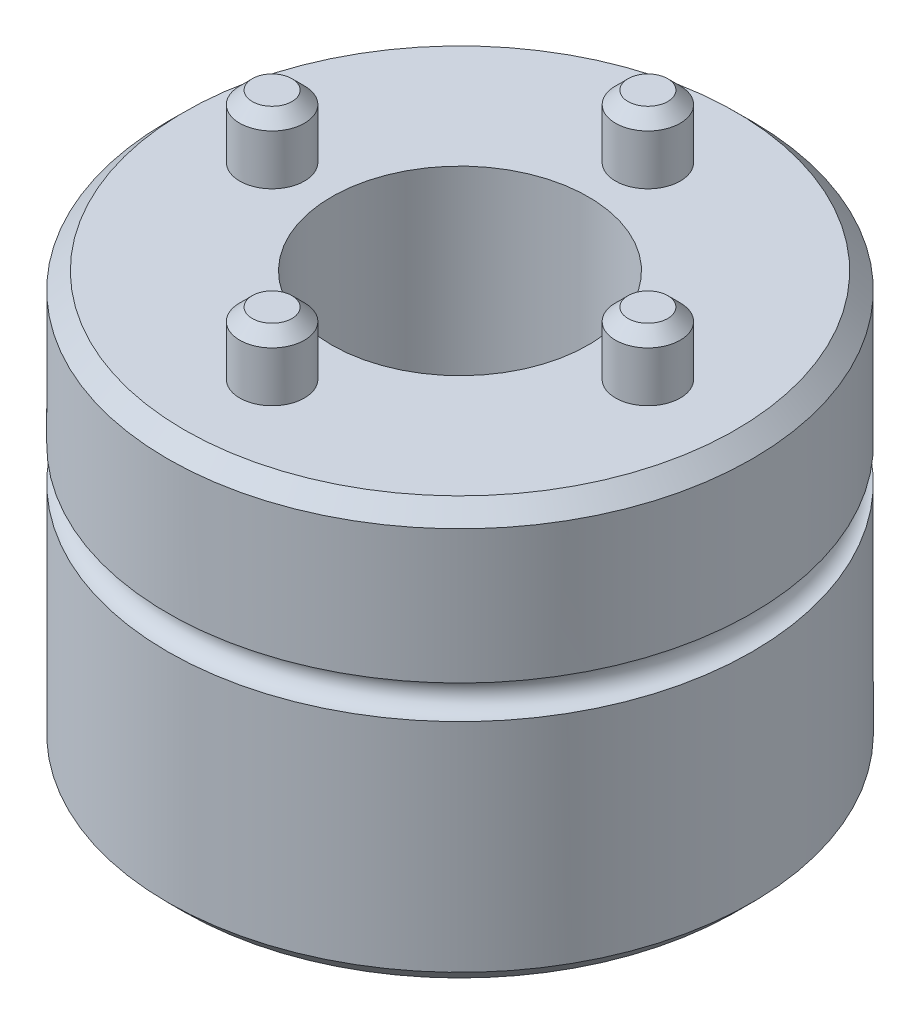
ISO-10303-21;
HEADER;
FILE_DESCRIPTION(('STEP AP214'),'2;1');
FILE_NAME('part.step','',(''),(''),'','','');
FILE_SCHEMA(('AUTOMOTIVE_DESIGN { 1 0 10303 214 1 1 1 1 }'));
ENDSEC;
DATA;
#1=APPLICATION_CONTEXT('core data for automotive mechanical design processes');
#2=APPLICATION_PROTOCOL_DEFINITION('international standard','automotive_design',2000,#1);
#3=PRODUCT_CONTEXT('',#1,'mechanical');
#4=PRODUCT('Part','Part','',(#3));
#5=PRODUCT_RELATED_PRODUCT_CATEGORY('part','',(#4));
#6=PRODUCT_DEFINITION_FORMATION('','',#4);
#7=PRODUCT_DEFINITION_CONTEXT('part definition',#1,'design');
#8=PRODUCT_DEFINITION('design','',#6,#7);
#9=PRODUCT_DEFINITION_SHAPE('','',#8);
#10=(LENGTH_UNIT() NAMED_UNIT(*) SI_UNIT(.MILLI.,.METRE.));
#11=(NAMED_UNIT(*) PLANE_ANGLE_UNIT() SI_UNIT($,.RADIAN.));
#12=(NAMED_UNIT(*) SI_UNIT($,.STERADIAN.) SOLID_ANGLE_UNIT());
#13=UNCERTAINTY_MEASURE_WITH_UNIT(LENGTH_MEASURE(1.E-05),#10,'distance_accuracy_value','');
#14=(GEOMETRIC_REPRESENTATION_CONTEXT(3) GLOBAL_UNCERTAINTY_ASSIGNED_CONTEXT((#13)) GLOBAL_UNIT_ASSIGNED_CONTEXT((#10,
#11,#12)) REPRESENTATION_CONTEXT('',''));
#15=CARTESIAN_POINT('',(0.,0.,0.));
#16=DIRECTION('',(0.,0.,1.));
#17=DIRECTION('',(1.,0.,0.));
#18=AXIS2_PLACEMENT_3D('',#15,#16,#17);
#19=CARTESIAN_POINT('',(0.,5.,0.));
#20=DIRECTION('',(0.,-1.,0.));
#21=DIRECTION('',(0.,0.,-1.));
#22=AXIS2_PLACEMENT_3D('',#19,#20,#21);
#23=CYLINDRICAL_SURFACE('',#22,7.);
#24=CARTESIAN_POINT('',(0.,-4.6,0.));
#25=DIRECTION('',(0.,1.,0.));
#26=DIRECTION('',(0.,0.,1.));
#27=AXIS2_PLACEMENT_3D('',#24,#25,#26);
#28=CIRCLE('',#27,7.);
#29=CARTESIAN_POINT('',(0.,-4.6,7.));
#30=VERTEX_POINT('',#29);
#31=EDGE_CURVE('E59',#30,#30,#28,.T.);
#32=ORIENTED_EDGE('',*,*,#31,.T.);
#33=EDGE_LOOP('',(#32));
#34=FACE_BOUND('',#33,.T.);
#35=CARTESIAN_POINT('',(0.,0.6,0.));
#36=DIRECTION('',(0.,1.,0.));
#37=DIRECTION('',(0.,0.,1.));
#38=AXIS2_PLACEMENT_3D('',#35,#36,#37);
#39=CIRCLE('',#38,7.);
#40=CARTESIAN_POINT('',(0.,0.6,7.));
#41=VERTEX_POINT('',#40);
#42=EDGE_CURVE('E65',#41,#41,#39,.F.);
#43=ORIENTED_EDGE('',*,*,#42,.T.);
#44=EDGE_LOOP('',(#43));
#45=FACE_BOUND('',#44,.T.);
#46=ADVANCED_FACE('F43',(#34,#45),#23,.T.);
#47=CARTESIAN_POINT('',(0.,5.,0.));
#48=DIRECTION('',(0.,-1.,0.));
#49=DIRECTION('',(0.,0.,-1.));
#50=AXIS2_PLACEMENT_3D('',#47,#48,#49);
#51=CYLINDRICAL_SURFACE('',#50,0.975);
#52=CARTESIAN_POINT('',(0.,-5.,0.));
#53=DIRECTION('',(0.,1.,0.));
#54=DIRECTION('',(0.,0.,1.));
#55=AXIS2_PLACEMENT_3D('',#52,#53,#54);
#56=CIRCLE('',#55,0.975);
#57=CARTESIAN_POINT('',(0.,-5.,0.975));
#58=VERTEX_POINT('',#57);
#59=EDGE_CURVE('E107',#58,#58,#56,.T.);
#60=ORIENTED_EDGE('',*,*,#59,.F.);
#61=EDGE_LOOP('',(#60));
#62=FACE_BOUND('',#61,.T.);
#63=CARTESIAN_POINT('',(0.,0.,0.));
#64=DIRECTION('',(0.,1.,0.));
#65=DIRECTION('',(0.,0.,1.));
#66=AXIS2_PLACEMENT_3D('',#63,#64,#65);
#67=CIRCLE('',#66,0.975);
#68=CARTESIAN_POINT('',(0.,0.,0.975));
#69=VERTEX_POINT('',#68);
#70=EDGE_CURVE('E108',#69,#69,#67,.T.);
#71=ORIENTED_EDGE('',*,*,#70,.T.);
#72=EDGE_LOOP('',(#71));
#73=FACE_BOUND('',#72,.T.);
#74=ADVANCED_FACE('F131',(#62,#73),#51,.F.);
#75=CARTESIAN_POINT('',(0.,5.,0.));
#76=DIRECTION('',(0.,1.,0.));
#77=DIRECTION('',(0.,0.,1.));
#78=AXIS2_PLACEMENT_3D('',#75,#76,#77);
#79=PLANE('',#78);
#80=CARTESIAN_POINT('',(0.,5.,0.));
#81=DIRECTION('',(0.,1.,0.));
#82=DIRECTION('',(0.,0.,1.));
#83=AXIS2_PLACEMENT_3D('',#80,#81,#82);
#84=CIRCLE('',#83,6.6);
#85=CARTESIAN_POINT('',(0.,5.,6.6));
#86=VERTEX_POINT('',#85);
#87=EDGE_CURVE('E51',#86,#86,#84,.T.);
#88=ORIENTED_EDGE('',*,*,#87,.T.);
#89=EDGE_LOOP('',(#88));
#90=FACE_BOUND('',#89,.T.);
#91=CARTESIAN_POINT('',(0.,5.,-4.5));
#92=DIRECTION('',(0.,1.,0.));
#93=DIRECTION('',(0.,0.,1.));
#94=AXIS2_PLACEMENT_3D('',#91,#92,#93);
#95=CIRCLE('',#94,0.775);
#96=CARTESIAN_POINT('',(0.,5.,-3.725));
#97=VERTEX_POINT('',#96);
#98=EDGE_CURVE('E89',#97,#97,#95,.T.);
#99=ORIENTED_EDGE('',*,*,#98,.F.);
#100=EDGE_LOOP('',(#99));
#101=FACE_BOUND('',#100,.T.);
#102=CARTESIAN_POINT('',(-4.5,5.,0.));
#103=DIRECTION('',(0.,1.,0.));
#104=DIRECTION('',(0.,0.,1.));
#105=AXIS2_PLACEMENT_3D('',#102,#103,#104);
#106=CIRCLE('',#105,0.775);
#107=CARTESIAN_POINT('',(-4.5,5.,0.775));
#108=VERTEX_POINT('',#107);
#109=EDGE_CURVE('E92',#108,#108,#106,.T.);
#110=ORIENTED_EDGE('',*,*,#109,.F.);
#111=EDGE_LOOP('',(#110));
#112=FACE_BOUND('',#111,.T.);
#113=CARTESIAN_POINT('',(0.,5.,4.5));
#114=DIRECTION('',(0.,1.,0.));
#115=DIRECTION('',(0.,0.,1.));
#116=AXIS2_PLACEMENT_3D('',#113,#114,#115);
#117=CIRCLE('',#116,0.775);
#118=CARTESIAN_POINT('',(0.,5.,5.275));
#119=VERTEX_POINT('',#118);
#120=EDGE_CURVE('E95',#119,#119,#117,.T.);
#121=ORIENTED_EDGE('',*,*,#120,.F.);
#122=EDGE_LOOP('',(#121));
#123=FACE_BOUND('',#122,.T.);
#124=CARTESIAN_POINT('',(4.5,5.,0.));
#125=DIRECTION('',(0.,1.,0.));
#126=DIRECTION('',(0.,0.,1.));
#127=AXIS2_PLACEMENT_3D('',#124,#125,#126);
#128=CIRCLE('',#127,0.775);
#129=CARTESIAN_POINT('',(4.5,5.,0.775));
#130=VERTEX_POINT('',#129);
#131=EDGE_CURVE('E104',#130,#130,#128,.T.);
#132=ORIENTED_EDGE('',*,*,#131,.F.);
#133=EDGE_LOOP('',(#132));
#134=FACE_BOUND('',#133,.T.);
#135=CARTESIAN_POINT('',(0.,5.,0.));
#136=DIRECTION('',(0.,1.,0.));
#137=DIRECTION('',(0.,0.,1.));
#138=AXIS2_PLACEMENT_3D('',#135,#136,#137);
#139=CIRCLE('',#138,3.075);
#140=CARTESIAN_POINT('',(0.,5.,3.075));
#141=VERTEX_POINT('',#140);
#142=EDGE_CURVE('E68',#141,#141,#139,.T.);
#143=ORIENTED_EDGE('',*,*,#142,.F.);
#144=EDGE_LOOP('',(#143));
#145=FACE_BOUND('',#144,.T.);
#146=ADVANCED_FACE('F128',(#90,#101,#112,#123,#134,#145),#79,.T.);
#147=CARTESIAN_POINT('',(0.,-5.,0.));
#148=DIRECTION('',(0.,1.,0.));
#149=DIRECTION('',(0.,0.,1.));
#150=AXIS2_PLACEMENT_3D('',#147,#148,#149);
#151=PLANE('',#150);
#152=CARTESIAN_POINT('',(0.,-5.,0.));
#153=DIRECTION('',(0.,1.,0.));
#154=DIRECTION('',(0.,0.,1.));
#155=AXIS2_PLACEMENT_3D('',#152,#153,#154);
#156=CIRCLE('',#155,6.6);
#157=CARTESIAN_POINT('',(0.,-5.,6.6));
#158=VERTEX_POINT('',#157);
#159=EDGE_CURVE('E55',#158,#158,#156,.F.);
#160=ORIENTED_EDGE('',*,*,#159,.T.);
#161=EDGE_LOOP('',(#160));
#162=FACE_BOUND('',#161,.T.);
#163=ORIENTED_EDGE('',*,*,#59,.T.);
#164=EDGE_LOOP('',(#163));
#165=FACE_BOUND('',#164,.T.);
#166=ADVANCED_FACE('F130',(#162,#165),#151,.F.);
#167=CARTESIAN_POINT('',(0.,4.6,0.));
#168=DIRECTION('',(0.,1.,0.));
#169=DIRECTION('',(0.,0.,1.));
#170=AXIS2_PLACEMENT_3D('',#167,#168,#169);
#171=CIRCLE('',#170,7.);
#172=CARTESIAN_POINT('',(0.,4.6,7.));
#173=VERTEX_POINT('',#172);
#174=EDGE_CURVE('E10',#173,#173,#171,.F.);
#175=ORIENTED_EDGE('',*,*,#174,.T.);
#176=EDGE_LOOP('',(#175));
#177=FACE_BOUND('',#176,.T.);
#178=CARTESIAN_POINT('',(0.,1.4,0.));
#179=DIRECTION('',(0.,-1.,0.));
#180=DIRECTION('',(0.,0.,-1.));
#181=AXIS2_PLACEMENT_3D('',#178,#179,#180);
#182=CIRCLE('',#181,7.);
#183=CARTESIAN_POINT('',(0.,1.4,-7.));
#184=VERTEX_POINT('',#183);
#185=EDGE_CURVE('E69',#184,#184,#182,.F.);
#186=ORIENTED_EDGE('',*,*,#185,.T.);
#187=EDGE_LOOP('',(#186));
#188=FACE_BOUND('',#187,.T.);
#189=ADVANCED_FACE('F124',(#177,#188),#23,.T.);
#190=CARTESIAN_POINT('',(0.,0.,0.));
#191=DIRECTION('',(0.,1.,0.));
#192=DIRECTION('',(0.,0.,1.));
#193=AXIS2_PLACEMENT_3D('',#190,#191,#192);
#194=CYLINDRICAL_SURFACE('',#193,3.075);
#195=CARTESIAN_POINT('',(0.,0.,0.));
#196=DIRECTION('',(0.,1.,0.));
#197=DIRECTION('',(0.,0.,1.));
#198=AXIS2_PLACEMENT_3D('',#195,#196,#197);
#199=CIRCLE('',#198,3.075);
#200=CARTESIAN_POINT('',(0.,0.,3.075));
#201=VERTEX_POINT('',#200);
#202=EDGE_CURVE('E111',#201,#201,#199,.T.);
#203=ORIENTED_EDGE('',*,*,#202,.F.);
#204=EDGE_LOOP('',(#203));
#205=FACE_BOUND('',#204,.T.);
#206=ORIENTED_EDGE('',*,*,#142,.T.);
#207=EDGE_LOOP('',(#206));
#208=FACE_BOUND('',#207,.T.);
#209=ADVANCED_FACE('F121',(#205,#208),#194,.F.);
#210=CARTESIAN_POINT('',(0.,0.,0.));
#211=DIRECTION('',(0.,1.,0.));
#212=DIRECTION('',(0.,0.,1.));
#213=AXIS2_PLACEMENT_3D('',#210,#211,#212);
#214=PLANE('',#213);
#215=ORIENTED_EDGE('',*,*,#70,.F.);
#216=EDGE_LOOP('',(#215));
#217=FACE_BOUND('',#216,.T.);
#218=ORIENTED_EDGE('',*,*,#202,.T.);
#219=EDGE_LOOP('',(#218));
#220=FACE_BOUND('',#219,.T.);
#221=ADVANCED_FACE('F119',(#217,#220),#214,.T.);
#222=CARTESIAN_POINT('',(4.5,6.5,0.));
#223=DIRECTION('',(0.,-1.,0.));
#224=DIRECTION('',(0.,0.,-1.));
#225=AXIS2_PLACEMENT_3D('',#222,#223,#224);
#226=CYLINDRICAL_SURFACE('',#225,0.775);
#227=CARTESIAN_POINT('',(4.5,6.20000000000001,0.));
#228=DIRECTION('',(0.,-1.,0.));
#229=DIRECTION('',(0.,0.,-1.));
#230=AXIS2_PLACEMENT_3D('',#227,#228,#229);
#231=CIRCLE('',#230,0.775);
#232=CARTESIAN_POINT('',(4.5,6.20000000000001,-0.775));
#233=VERTEX_POINT('',#232);
#234=EDGE_CURVE('E101',#233,#233,#231,.T.);
#235=ORIENTED_EDGE('',*,*,#234,.T.);
#236=EDGE_LOOP('',(#235));
#237=FACE_BOUND('',#236,.T.);
#238=ORIENTED_EDGE('',*,*,#131,.T.);
#239=EDGE_LOOP('',(#238));
#240=FACE_BOUND('',#239,.T.);
#241=ADVANCED_FACE('F200',(#237,#240),#226,.T.);
#242=CARTESIAN_POINT('',(4.5,6.5,0.));
#243=DIRECTION('',(0.,-1.,0.));
#244=DIRECTION('',(0.,0.,-1.));
#245=AXIS2_PLACEMENT_3D('',#242,#243,#244);
#246=PLANE('',#245);
#247=CARTESIAN_POINT('',(4.5,6.5,0.));
#248=DIRECTION('',(0.,-1.,0.));
#249=DIRECTION('',(0.,0.,-1.));
#250=AXIS2_PLACEMENT_3D('',#247,#248,#249);
#251=CIRCLE('',#250,0.475000000000003);
#252=CARTESIAN_POINT('',(4.5,6.5,-0.475000000000003));
#253=VERTEX_POINT('',#252);
#254=EDGE_CURVE('E98',#253,#253,#251,.F.);
#255=ORIENTED_EDGE('',*,*,#254,.T.);
#256=EDGE_LOOP('',(#255));
#257=FACE_BOUND('',#256,.T.);
#258=ADVANCED_FACE('F197',(#257),#246,.F.);
#259=CARTESIAN_POINT('',(4.5,6.20000000000001,0.));
#260=DIRECTION('',(0.,-1.,0.));
#261=DIRECTION('',(0.,0.,-1.));
#262=AXIS2_PLACEMENT_3D('',#259,#260,#261);
#263=CONICAL_SURFACE('',#262,0.775,0.785398163397451);
#264=ORIENTED_EDGE('',*,*,#254,.F.);
#265=EDGE_LOOP('',(#264));
#266=FACE_BOUND('',#265,.T.);
#267=ORIENTED_EDGE('',*,*,#234,.F.);
#268=EDGE_LOOP('',(#267));
#269=FACE_BOUND('',#268,.T.);
#270=ADVANCED_FACE('F195',(#266,#269),#263,.T.);
#271=CARTESIAN_POINT('',(0.,6.5,4.5));
#272=DIRECTION('',(0.,-1.,0.));
#273=DIRECTION('',(0.,0.,-1.));
#274=AXIS2_PLACEMENT_3D('',#271,#272,#273);
#275=CYLINDRICAL_SURFACE('',#274,0.775);
#276=CARTESIAN_POINT('',(0.,6.20000000000001,4.5));
#277=DIRECTION('',(0.,-1.,0.));
#278=DIRECTION('',(0.,0.,-1.));
#279=AXIS2_PLACEMENT_3D('',#276,#277,#278);
#280=CIRCLE('',#279,0.775);
#281=CARTESIAN_POINT('',(0.,6.20000000000001,3.725));
#282=VERTEX_POINT('',#281);
#283=EDGE_CURVE('E86',#282,#282,#280,.T.);
#284=ORIENTED_EDGE('',*,*,#283,.T.);
#285=EDGE_LOOP('',(#284));
#286=FACE_BOUND('',#285,.T.);
#287=ORIENTED_EDGE('',*,*,#120,.T.);
#288=EDGE_LOOP('',(#287));
#289=FACE_BOUND('',#288,.T.);
#290=ADVANCED_FACE('F191',(#286,#289),#275,.T.);
#291=CARTESIAN_POINT('',(0.,6.5,4.5));
#292=DIRECTION('',(0.,-1.,0.));
#293=DIRECTION('',(1.,0.,0.));
#294=AXIS2_PLACEMENT_3D('',#291,#292,#293);
#295=PLANE('',#294);
#296=CARTESIAN_POINT('',(0.,6.5,4.5));
#297=DIRECTION('',(0.,-1.,0.));
#298=DIRECTION('',(0.,0.,-1.));
#299=AXIS2_PLACEMENT_3D('',#296,#297,#298);
#300=CIRCLE('',#299,0.475000000000003);
#301=CARTESIAN_POINT('',(0.,6.5,4.025));
#302=VERTEX_POINT('',#301);
#303=EDGE_CURVE('E83',#302,#302,#300,.F.);
#304=ORIENTED_EDGE('',*,*,#303,.T.);
#305=EDGE_LOOP('',(#304));
#306=FACE_BOUND('',#305,.T.);
#307=ADVANCED_FACE('F187',(#306),#295,.F.);
#308=CARTESIAN_POINT('',(-4.5,6.5,0.));
#309=DIRECTION('',(0.,-1.,0.));
#310=DIRECTION('',(0.,0.,-1.));
#311=AXIS2_PLACEMENT_3D('',#308,#309,#310);
#312=CYLINDRICAL_SURFACE('',#311,0.775);
#313=CARTESIAN_POINT('',(-4.5,6.20000000000001,0.));
#314=DIRECTION('',(0.,-1.,0.));
#315=DIRECTION('',(0.,0.,-1.));
#316=AXIS2_PLACEMENT_3D('',#313,#314,#315);
#317=CIRCLE('',#316,0.775);
#318=CARTESIAN_POINT('',(-4.5,6.20000000000001,-0.775));
#319=VERTEX_POINT('',#318);
#320=EDGE_CURVE('E80',#319,#319,#317,.T.);
#321=ORIENTED_EDGE('',*,*,#320,.T.);
#322=EDGE_LOOP('',(#321));
#323=FACE_BOUND('',#322,.T.);
#324=ORIENTED_EDGE('',*,*,#109,.T.);
#325=EDGE_LOOP('',(#324));
#326=FACE_BOUND('',#325,.T.);
#327=ADVANCED_FACE('F183',(#323,#326),#312,.T.);
#328=CARTESIAN_POINT('',(-4.5,6.5,0.));
#329=DIRECTION('',(0.,-1.,0.));
#330=DIRECTION('',(0.,0.,1.));
#331=AXIS2_PLACEMENT_3D('',#328,#329,#330);
#332=PLANE('',#331);
#333=CARTESIAN_POINT('',(-4.5,6.5,0.));
#334=DIRECTION('',(0.,-1.,0.));
#335=DIRECTION('',(0.,0.,-1.));
#336=AXIS2_PLACEMENT_3D('',#333,#334,#335);
#337=CIRCLE('',#336,0.475000000000003);
#338=CARTESIAN_POINT('',(-4.5,6.5,-0.475000000000003));
#339=VERTEX_POINT('',#338);
#340=EDGE_CURVE('E77',#339,#339,#337,.F.);
#341=ORIENTED_EDGE('',*,*,#340,.T.);
#342=EDGE_LOOP('',(#341));
#343=FACE_BOUND('',#342,.T.);
#344=ADVANCED_FACE('F179',(#343),#332,.F.);
#345=CARTESIAN_POINT('',(0.,6.5,-4.5));
#346=DIRECTION('',(0.,-1.,0.));
#347=DIRECTION('',(0.,0.,-1.));
#348=AXIS2_PLACEMENT_3D('',#345,#346,#347);
#349=CYLINDRICAL_SURFACE('',#348,0.775);
#350=CARTESIAN_POINT('',(0.,6.20000000000001,-4.5));
#351=DIRECTION('',(0.,-1.,0.));
#352=DIRECTION('',(0.,0.,-1.));
#353=AXIS2_PLACEMENT_3D('',#350,#351,#352);
#354=CIRCLE('',#353,0.775);
#355=CARTESIAN_POINT('',(0.,6.20000000000001,-5.275));
#356=VERTEX_POINT('',#355);
#357=EDGE_CURVE('E74',#356,#356,#354,.T.);
#358=ORIENTED_EDGE('',*,*,#357,.T.);
#359=EDGE_LOOP('',(#358));
#360=FACE_BOUND('',#359,.T.);
#361=ORIENTED_EDGE('',*,*,#98,.T.);
#362=EDGE_LOOP('',(#361));
#363=FACE_BOUND('',#362,.T.);
#364=ADVANCED_FACE('F175',(#360,#363),#349,.T.);
#365=CARTESIAN_POINT('',(0.,6.5,-4.5));
#366=DIRECTION('',(0.,-1.,0.));
#367=DIRECTION('',(-1.,0.,0.));
#368=AXIS2_PLACEMENT_3D('',#365,#366,#367);
#369=PLANE('',#368);
#370=CARTESIAN_POINT('',(0.,6.5,-4.5));
#371=DIRECTION('',(0.,-1.,0.));
#372=DIRECTION('',(0.,0.,-1.));
#373=AXIS2_PLACEMENT_3D('',#370,#371,#372);
#374=CIRCLE('',#373,0.475000000000003);
#375=CARTESIAN_POINT('',(0.,6.5,-4.975));
#376=VERTEX_POINT('',#375);
#377=EDGE_CURVE('E64',#376,#376,#374,.F.);
#378=ORIENTED_EDGE('',*,*,#377,.T.);
#379=EDGE_LOOP('',(#378));
#380=FACE_BOUND('',#379,.T.);
#381=ADVANCED_FACE('F171',(#380),#369,.F.);
#382=CARTESIAN_POINT('',(0.,6.20000000000001,4.5));
#383=DIRECTION('',(0.,-1.,0.));
#384=DIRECTION('',(0.,0.,-1.));
#385=AXIS2_PLACEMENT_3D('',#382,#383,#384);
#386=CONICAL_SURFACE('',#385,0.775,0.785398163397451);
#387=ORIENTED_EDGE('',*,*,#303,.F.);
#388=EDGE_LOOP('',(#387));
#389=FACE_BOUND('',#388,.T.);
#390=ORIENTED_EDGE('',*,*,#283,.F.);
#391=EDGE_LOOP('',(#390));
#392=FACE_BOUND('',#391,.T.);
#393=ADVANCED_FACE('F174',(#389,#392),#386,.T.);
#394=CARTESIAN_POINT('',(-4.5,6.20000000000001,0.));
#395=DIRECTION('',(0.,-1.,0.));
#396=DIRECTION('',(0.,0.,-1.));
#397=AXIS2_PLACEMENT_3D('',#394,#395,#396);
#398=CONICAL_SURFACE('',#397,0.775,0.785398163397451);
#399=ORIENTED_EDGE('',*,*,#340,.F.);
#400=EDGE_LOOP('',(#399));
#401=FACE_BOUND('',#400,.T.);
#402=ORIENTED_EDGE('',*,*,#320,.F.);
#403=EDGE_LOOP('',(#402));
#404=FACE_BOUND('',#403,.T.);
#405=ADVANCED_FACE('F167',(#401,#404),#398,.T.);
#406=CARTESIAN_POINT('',(0.,6.20000000000001,-4.5));
#407=DIRECTION('',(0.,-1.,0.));
#408=DIRECTION('',(0.,0.,-1.));
#409=AXIS2_PLACEMENT_3D('',#406,#407,#408);
#410=CONICAL_SURFACE('',#409,0.775,0.785398163397451);
#411=ORIENTED_EDGE('',*,*,#377,.F.);
#412=EDGE_LOOP('',(#411));
#413=FACE_BOUND('',#412,.T.);
#414=ORIENTED_EDGE('',*,*,#357,.F.);
#415=EDGE_LOOP('',(#414));
#416=FACE_BOUND('',#415,.T.);
#417=ADVANCED_FACE('F159',(#413,#416),#410,.T.);
#418=CARTESIAN_POINT('',(0.,1.,0.));
#419=DIRECTION('',(0.,-1.,0.));
#420=DIRECTION('',(0.,0.,-1.));
#421=AXIS2_PLACEMENT_3D('',#418,#419,#420);
#422=TOROIDAL_SURFACE('',#421,7.,0.4);
#423=ORIENTED_EDGE('',*,*,#185,.F.);
#424=EDGE_LOOP('',(#423));
#425=FACE_BOUND('',#424,.T.);
#426=ORIENTED_EDGE('',*,*,#42,.F.);
#427=EDGE_LOOP('',(#426));
#428=FACE_BOUND('',#427,.T.);
#429=ADVANCED_FACE('F155',(#425,#428),#422,.F.);
#430=CARTESIAN_POINT('',(0.,-4.6,0.));
#431=DIRECTION('',(0.,1.,0.));
#432=DIRECTION('',(0.,0.,1.));
#433=AXIS2_PLACEMENT_3D('',#430,#431,#432);
#434=CONICAL_SURFACE('',#433,7.,0.785398163397449);
#435=CARTESIAN_POINT('',(0.,-5.,6.6));
#436=CARTESIAN_POINT('',(0.,-4.99583333333333,6.60416666666667));
#437=CARTESIAN_POINT('',(0.,-4.99166666666667,6.60833333333333));
#438=CARTESIAN_POINT('',(0.,-4.98333333333333,6.61666666666667));
#439=CARTESIAN_POINT('',(0.,-4.97916666666667,6.62083333333333));
#440=CARTESIAN_POINT('',(0.,-4.97083333333333,6.62916666666667));
#441=CARTESIAN_POINT('',(0.,-4.96666666666667,6.63333333333333));
#442=CARTESIAN_POINT('',(0.,-4.95833333333333,6.64166666666667));
#443=CARTESIAN_POINT('',(0.,-4.95416666666667,6.64583333333333));
#444=CARTESIAN_POINT('',(0.,-4.94583333333333,6.65416666666667));
#445=CARTESIAN_POINT('',(0.,-4.94166666666667,6.65833333333333));
#446=CARTESIAN_POINT('',(0.,-4.93333333333333,6.66666666666667));
#447=CARTESIAN_POINT('',(0.,-4.92916666666667,6.67083333333333));
#448=CARTESIAN_POINT('',(0.,-4.92083333333333,6.67916666666667));
#449=CARTESIAN_POINT('',(0.,-4.91666666666667,6.68333333333333));
#450=CARTESIAN_POINT('',(0.,-4.90833333333333,6.69166666666667));
#451=CARTESIAN_POINT('',(0.,-4.90416666666667,6.69583333333333));
#452=CARTESIAN_POINT('',(0.,-4.89583333333333,6.70416666666667));
#453=CARTESIAN_POINT('',(0.,-4.89166666666667,6.70833333333333));
#454=CARTESIAN_POINT('',(0.,-4.88333333333333,6.71666666666667));
#455=CARTESIAN_POINT('',(0.,-4.87916666666667,6.72083333333333));
#456=CARTESIAN_POINT('',(0.,-4.87083333333333,6.72916666666667));
#457=CARTESIAN_POINT('',(0.,-4.86666666666667,6.73333333333333));
#458=CARTESIAN_POINT('',(0.,-4.85833333333333,6.74166666666667));
#459=CARTESIAN_POINT('',(0.,-4.85416666666667,6.74583333333333));
#460=CARTESIAN_POINT('',(0.,-4.84583333333333,6.75416666666667));
#461=CARTESIAN_POINT('',(0.,-4.84166666666667,6.75833333333333));
#462=CARTESIAN_POINT('',(0.,-4.83333333333333,6.76666666666667));
#463=CARTESIAN_POINT('',(0.,-4.82916666666667,6.77083333333333));
#464=CARTESIAN_POINT('',(0.,-4.82083333333333,6.77916666666667));
#465=CARTESIAN_POINT('',(0.,-4.81666666666667,6.78333333333333));
#466=CARTESIAN_POINT('',(0.,-4.80833333333333,6.79166666666667));
#467=CARTESIAN_POINT('',(0.,-4.80416666666667,6.79583333333333));
#468=CARTESIAN_POINT('',(0.,-4.79583333333333,6.80416666666667));
#469=CARTESIAN_POINT('',(0.,-4.79166666666667,6.80833333333333));
#470=CARTESIAN_POINT('',(0.,-4.78333333333333,6.81666666666667));
#471=CARTESIAN_POINT('',(0.,-4.77916666666667,6.82083333333333));
#472=CARTESIAN_POINT('',(0.,-4.77083333333333,6.82916666666667));
#473=CARTESIAN_POINT('',(0.,-4.76666666666667,6.83333333333333));
#474=CARTESIAN_POINT('',(0.,-4.75833333333333,6.84166666666667));
#475=CARTESIAN_POINT('',(0.,-4.75416666666667,6.84583333333333));
#476=CARTESIAN_POINT('',(0.,-4.74583333333333,6.85416666666667));
#477=CARTESIAN_POINT('',(0.,-4.74166666666667,6.85833333333333));
#478=CARTESIAN_POINT('',(0.,-4.73333333333333,6.86666666666667));
#479=CARTESIAN_POINT('',(0.,-4.72916666666667,6.87083333333333));
#480=CARTESIAN_POINT('',(0.,-4.72083333333333,6.87916666666667));
#481=CARTESIAN_POINT('',(0.,-4.71666666666667,6.88333333333333));
#482=CARTESIAN_POINT('',(0.,-4.70833333333333,6.89166666666667));
#483=CARTESIAN_POINT('',(0.,-4.70416666666667,6.89583333333333));
#484=CARTESIAN_POINT('',(0.,-4.69583333333333,6.90416666666667));
#485=CARTESIAN_POINT('',(0.,-4.69166666666667,6.90833333333333));
#486=CARTESIAN_POINT('',(0.,-4.68333333333333,6.91666666666667));
#487=CARTESIAN_POINT('',(0.,-4.67916666666667,6.92083333333333));
#488=CARTESIAN_POINT('',(0.,-4.67083333333333,6.92916666666667));
#489=CARTESIAN_POINT('',(0.,-4.66666666666667,6.93333333333333));
#490=CARTESIAN_POINT('',(0.,-4.65833333333333,6.94166666666667));
#491=CARTESIAN_POINT('',(0.,-4.65416666666667,6.94583333333333));
#492=CARTESIAN_POINT('',(0.,-4.64583333333333,6.95416666666667));
#493=CARTESIAN_POINT('',(0.,-4.64166666666667,6.95833333333333));
#494=CARTESIAN_POINT('',(0.,-4.63333333333333,6.96666666666667));
#495=CARTESIAN_POINT('',(0.,-4.62916666666667,6.97083333333333));
#496=CARTESIAN_POINT('',(0.,-4.62083333333333,6.97916666666667));
#497=CARTESIAN_POINT('',(0.,-4.61666666666667,6.98333333333333));
#498=CARTESIAN_POINT('',(0.,-4.60833333333333,6.99166666666667));
#499=CARTESIAN_POINT('',(0.,-4.60416666666667,6.99583333333333));
#500=CARTESIAN_POINT('',(0.,-4.6,7.));
#501=B_SPLINE_CURVE_WITH_KNOTS('',3,(#435,#436,#437,#438,#439,#440,#441,#442,#443,#444,#445,
#446,#447,#448,#449,#450,#451,#452,#453,#454,#455,#456,#457,#458,#459,#460,#461,#462,#463,#464,
#465,#466,#467,#468,#469,#470,#471,#472,#473,#474,#475,#476,#477,#478,#479,#480,#481,#482,#483,
#484,#485,#486,#487,#488,#489,#490,#491,#492,#493,#494,#495,#496,#497,#498,#499,#500),
.UNSPECIFIED.,.F.,.F.,(4,2,2,2,2,2,2,2,2,2,2,2,2,2,2,2,2,2,2,2,2,2,2,2,2,2,2,2,2,2,2,2,4),(0.,
0.0176776695296636,0.0353553390593278,0.0530330085889907,0.0707106781186549,0.0883883476483179,
0.106066017177982,0.123743686707646,0.141421356237309,0.159099025766973,0.176776695296636,
0.194454364826301,0.212132034355964,0.229809703885628,0.247487373415291,0.265165042944955,
0.282842712474619,0.300520382004283,0.318198051533946,0.33587572106361,0.353553390593274,
0.371231060122937,0.388908729652601,0.406586399182264,0.424264068711929,0.441941738241592,
0.459619407771256,0.47729707730092,0.494974746830583,0.512652416360247,0.53033008588991,
0.548007755419574,0.565685424949238),.UNSPECIFIED.);
#502=EDGE_CURVE('BSEAM158',#158,#30,#501,.T.);
#503=ORIENTED_EDGE('',*,*,#159,.F.);
#504=ORIENTED_EDGE('',*,*,#31,.F.);
#505=ORIENTED_EDGE('',*,*,#502,.T.);
#506=ORIENTED_EDGE('',*,*,#502,.F.);
#507=EDGE_LOOP('',(#503,#505,#504,#506));
#508=FACE_BOUND('',#507,.T.);
#509=ADVANCED_FACE('F158',(#508),#434,.T.);
#510=CARTESIAN_POINT('',(0.,5.,0.));
#511=DIRECTION('',(0.,-1.,0.));
#512=DIRECTION('',(0.,0.,-1.));
#513=AXIS2_PLACEMENT_3D('',#510,#511,#512);
#514=CONICAL_SURFACE('',#513,6.6,0.785398163397445);
#515=ORIENTED_EDGE('',*,*,#174,.F.);
#516=EDGE_LOOP('',(#515));
#517=FACE_BOUND('',#516,.T.);
#518=ORIENTED_EDGE('',*,*,#87,.F.);
#519=EDGE_LOOP('',(#518));
#520=FACE_BOUND('',#519,.T.);
#521=ADVANCED_FACE('F46',(#517,#520),#514,.T.);
#522=CLOSED_SHELL('',(#46,#74,#146,#166,#189,#209,#221,#241,#258,#270,#290,#307,#327,#344,#364,
#381,#393,#405,#417,#429,#509,#521));
#523=MANIFOLD_SOLID_BREP('B2',#522);
#524=ADVANCED_BREP_SHAPE_REPRESENTATION('',(#18,#523),#14);
#525=SHAPE_DEFINITION_REPRESENTATION(#9,#524);
ENDSEC;
END-ISO-10303-21;
